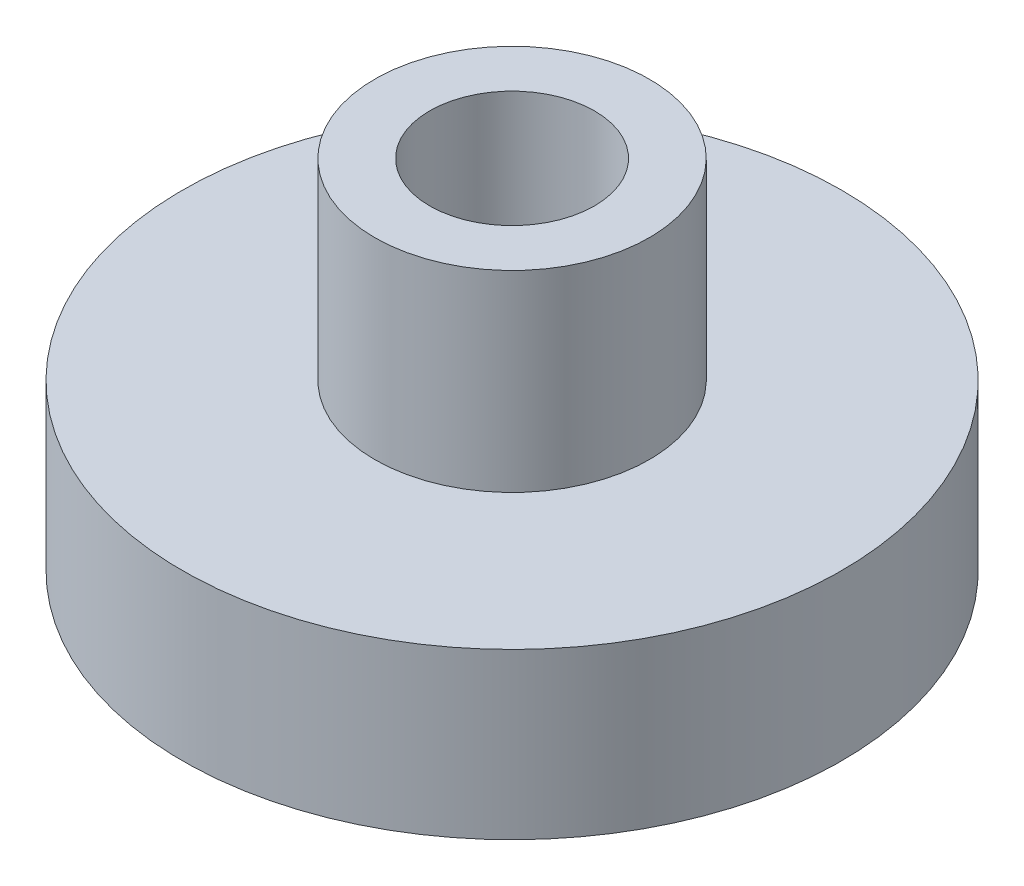
ISO-10303-21;
HEADER;
FILE_DESCRIPTION(('STEP AP214'),'2;1');
FILE_NAME('part.step','',(''),(''),'','','');
FILE_SCHEMA(('AUTOMOTIVE_DESIGN { 1 0 10303 214 1 1 1 1 }'));
ENDSEC;
DATA;
#1=APPLICATION_CONTEXT('core data for automotive mechanical design processes');
#2=APPLICATION_PROTOCOL_DEFINITION('international standard','automotive_design',2000,#1);
#3=PRODUCT_CONTEXT('',#1,'mechanical');
#4=PRODUCT('Part','Part','',(#3));
#5=PRODUCT_RELATED_PRODUCT_CATEGORY('part','',(#4));
#6=PRODUCT_DEFINITION_FORMATION('','',#4);
#7=PRODUCT_DEFINITION_CONTEXT('part definition',#1,'design');
#8=PRODUCT_DEFINITION('design','',#6,#7);
#9=PRODUCT_DEFINITION_SHAPE('','',#8);
#10=(LENGTH_UNIT() NAMED_UNIT(*) SI_UNIT(.MILLI.,.METRE.));
#11=(NAMED_UNIT(*) PLANE_ANGLE_UNIT() SI_UNIT($,.RADIAN.));
#12=(NAMED_UNIT(*) SI_UNIT($,.STERADIAN.) SOLID_ANGLE_UNIT());
#13=UNCERTAINTY_MEASURE_WITH_UNIT(LENGTH_MEASURE(1.E-05),#10,'distance_accuracy_value','');
#14=(GEOMETRIC_REPRESENTATION_CONTEXT(3) GLOBAL_UNCERTAINTY_ASSIGNED_CONTEXT((#13)) GLOBAL_UNIT_ASSIGNED_CONTEXT((#10,
#11,#12)) REPRESENTATION_CONTEXT('',''));
#15=CARTESIAN_POINT('',(0.,0.,0.));
#16=DIRECTION('',(0.,0.,1.));
#17=DIRECTION('',(1.,0.,0.));
#18=AXIS2_PLACEMENT_3D('',#15,#16,#17);
#19=CARTESIAN_POINT('',(0.,3.5,0.));
#20=DIRECTION('',(0.,1.,0.));
#21=DIRECTION('',(0.,0.,1.));
#22=AXIS2_PLACEMENT_3D('',#19,#20,#21);
#23=PLANE('',#22);
#24=CARTESIAN_POINT('',(0.,3.5,0.));
#25=DIRECTION('',(0.,1.,0.));
#26=DIRECTION('',(0.,0.,1.));
#27=AXIS2_PLACEMENT_3D('',#24,#25,#26);
#28=CIRCLE('',#27,2.5);
#29=CARTESIAN_POINT('',(0.,3.5,2.5));
#30=VERTEX_POINT('',#29);
#31=EDGE_CURVE('E10',#30,#30,#28,.T.);
#32=ORIENTED_EDGE('',*,*,#31,.T.);
#33=EDGE_LOOP('',(#32));
#34=FACE_BOUND('',#33,.T.);
#35=CARTESIAN_POINT('',(0.,3.5,0.));
#36=DIRECTION('',(0.,1.,0.));
#37=DIRECTION('',(0.,0.,1.));
#38=AXIS2_PLACEMENT_3D('',#35,#36,#37);
#39=CIRCLE('',#38,1.5);
#40=CARTESIAN_POINT('',(0.,3.5,1.5));
#41=VERTEX_POINT('',#40);
#42=EDGE_CURVE('E47',#41,#41,#39,.T.);
#43=ORIENTED_EDGE('',*,*,#42,.F.);
#44=EDGE_LOOP('',(#43));
#45=FACE_BOUND('',#44,.T.);
#46=ADVANCED_FACE('F39',(#34,#45),#23,.T.);
#47=CARTESIAN_POINT('',(0.,3.5,0.));
#48=DIRECTION('',(0.,-1.,0.));
#49=DIRECTION('',(0.,0.,-1.));
#50=AXIS2_PLACEMENT_3D('',#47,#48,#49);
#51=CYLINDRICAL_SURFACE('',#50,2.5);
#52=ORIENTED_EDGE('',*,*,#31,.F.);
#53=EDGE_LOOP('',(#52));
#54=FACE_BOUND('',#53,.T.);
#55=CARTESIAN_POINT('',(0.,0.,0.));
#56=DIRECTION('',(0.,1.,0.));
#57=DIRECTION('',(0.,0.,1.));
#58=AXIS2_PLACEMENT_3D('',#55,#56,#57);
#59=CIRCLE('',#58,2.5);
#60=CARTESIAN_POINT('',(0.,0.,2.5));
#61=VERTEX_POINT('',#60);
#62=EDGE_CURVE('E43',#61,#61,#59,.T.);
#63=ORIENTED_EDGE('',*,*,#62,.T.);
#64=EDGE_LOOP('',(#63));
#65=FACE_BOUND('',#64,.T.);
#66=ADVANCED_FACE('F41',(#54,#65),#51,.T.);
#67=CARTESIAN_POINT('',(0.,3.5,0.));
#68=DIRECTION('',(0.,-1.,0.));
#69=DIRECTION('',(0.,0.,-1.));
#70=AXIS2_PLACEMENT_3D('',#67,#68,#69);
#71=CYLINDRICAL_SURFACE('',#70,1.5);
#72=ORIENTED_EDGE('',*,*,#42,.T.);
#73=EDGE_LOOP('',(#72));
#74=FACE_BOUND('',#73,.T.);
#75=CARTESIAN_POINT('',(0.,-3.,0.));
#76=DIRECTION('',(0.,-1.,0.));
#77=DIRECTION('',(0.,0.,-1.));
#78=AXIS2_PLACEMENT_3D('',#75,#76,#77);
#79=CIRCLE('',#78,1.5);
#80=CARTESIAN_POINT('',(0.,-3.,-1.5));
#81=VERTEX_POINT('',#80);
#82=EDGE_CURVE('E57',#81,#81,#79,.T.);
#83=ORIENTED_EDGE('',*,*,#82,.T.);
#84=EDGE_LOOP('',(#83));
#85=FACE_BOUND('',#84,.T.);
#86=ADVANCED_FACE('F63',(#74,#85),#71,.F.);
#87=CARTESIAN_POINT('',(0.,-3.,0.));
#88=DIRECTION('',(0.,-1.,0.));
#89=DIRECTION('',(0.,0.,-1.));
#90=AXIS2_PLACEMENT_3D('',#87,#88,#89);
#91=PLANE('',#90);
#92=CARTESIAN_POINT('',(0.,-3.,0.));
#93=DIRECTION('',(0.,-1.,0.));
#94=DIRECTION('',(0.,0.,-1.));
#95=AXIS2_PLACEMENT_3D('',#92,#93,#94);
#96=CIRCLE('',#95,6.);
#97=CARTESIAN_POINT('',(0.,-3.,-6.));
#98=VERTEX_POINT('',#97);
#99=EDGE_CURVE('E56',#98,#98,#96,.T.);
#100=ORIENTED_EDGE('',*,*,#99,.T.);
#101=EDGE_LOOP('',(#100));
#102=FACE_BOUND('',#101,.T.);
#103=ORIENTED_EDGE('',*,*,#82,.F.);
#104=EDGE_LOOP('',(#103));
#105=FACE_BOUND('',#104,.T.);
#106=ADVANCED_FACE('F65',(#102,#105),#91,.T.);
#107=CARTESIAN_POINT('',(0.,0.,0.));
#108=DIRECTION('',(0.,-1.,0.));
#109=DIRECTION('',(0.,0.,-1.));
#110=AXIS2_PLACEMENT_3D('',#107,#108,#109);
#111=PLANE('',#110);
#112=ORIENTED_EDGE('',*,*,#62,.F.);
#113=EDGE_LOOP('',(#112));
#114=FACE_BOUND('',#113,.T.);
#115=CARTESIAN_POINT('',(0.,0.,0.));
#116=DIRECTION('',(0.,-1.,0.));
#117=DIRECTION('',(0.,0.,-1.));
#118=AXIS2_PLACEMENT_3D('',#115,#116,#117);
#119=CIRCLE('',#118,6.);
#120=CARTESIAN_POINT('',(0.,0.,-6.));
#121=VERTEX_POINT('',#120);
#122=EDGE_CURVE('E53',#121,#121,#119,.T.);
#123=ORIENTED_EDGE('',*,*,#122,.F.);
#124=EDGE_LOOP('',(#123));
#125=FACE_BOUND('',#124,.T.);
#126=ADVANCED_FACE('F67',(#114,#125),#111,.F.);
#127=CARTESIAN_POINT('',(0.,-3.,0.));
#128=DIRECTION('',(0.,1.,0.));
#129=DIRECTION('',(0.,0.,1.));
#130=AXIS2_PLACEMENT_3D('',#127,#128,#129);
#131=CYLINDRICAL_SURFACE('',#130,6.);
#132=ORIENTED_EDGE('',*,*,#99,.F.);
#133=EDGE_LOOP('',(#132));
#134=FACE_BOUND('',#133,.T.);
#135=ORIENTED_EDGE('',*,*,#122,.T.);
#136=EDGE_LOOP('',(#135));
#137=FACE_BOUND('',#136,.T.);
#138=ADVANCED_FACE('F74',(#134,#137),#131,.T.);
#139=CLOSED_SHELL('',(#46,#66,#86,#106,#126,#138));
#140=MANIFOLD_SOLID_BREP('B2',#139);
#141=ADVANCED_BREP_SHAPE_REPRESENTATION('',(#18,#140),#14);
#142=SHAPE_DEFINITION_REPRESENTATION(#9,#141);
ENDSEC;
END-ISO-10303-21;
